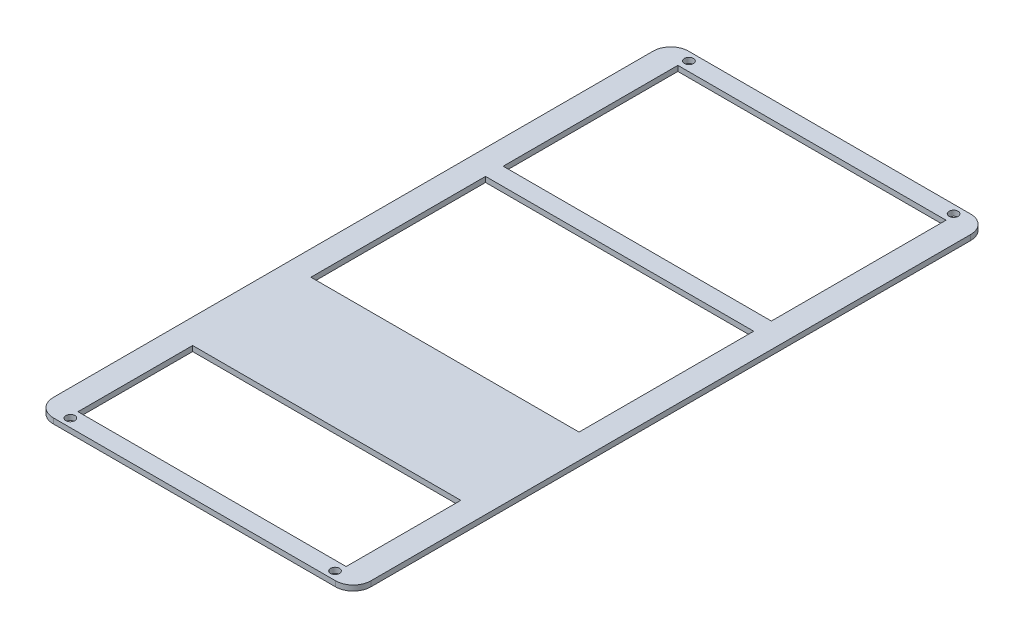
ISO-10303-21;
HEADER;
FILE_DESCRIPTION(('STEP AP214'),'2;1');
FILE_NAME('part.step','',(''),(''),'','','');
FILE_SCHEMA(('AUTOMOTIVE_DESIGN { 1 0 10303 214 1 1 1 1 }'));
ENDSEC;
DATA;
#1=APPLICATION_CONTEXT('core data for automotive mechanical design processes');
#2=APPLICATION_PROTOCOL_DEFINITION('international standard','automotive_design',2000,#1);
#3=PRODUCT_CONTEXT('',#1,'mechanical');
#4=PRODUCT('Part','Part','',(#3));
#5=PRODUCT_RELATED_PRODUCT_CATEGORY('part','',(#4));
#6=PRODUCT_DEFINITION_FORMATION('','',#4);
#7=PRODUCT_DEFINITION_CONTEXT('part definition',#1,'design');
#8=PRODUCT_DEFINITION('design','',#6,#7);
#9=PRODUCT_DEFINITION_SHAPE('','',#8);
#10=(LENGTH_UNIT() NAMED_UNIT(*) SI_UNIT(.MILLI.,.METRE.));
#11=(NAMED_UNIT(*) PLANE_ANGLE_UNIT() SI_UNIT($,.RADIAN.));
#12=(NAMED_UNIT(*) SI_UNIT($,.STERADIAN.) SOLID_ANGLE_UNIT());
#13=UNCERTAINTY_MEASURE_WITH_UNIT(LENGTH_MEASURE(1.E-05),#10,'distance_accuracy_value','');
#14=(GEOMETRIC_REPRESENTATION_CONTEXT(3) GLOBAL_UNCERTAINTY_ASSIGNED_CONTEXT((#13)) GLOBAL_UNIT_ASSIGNED_CONTEXT((#10,
#11,#12)) REPRESENTATION_CONTEXT('',''));
#15=CARTESIAN_POINT('',(0.,0.,0.));
#16=DIRECTION('',(0.,0.,1.));
#17=DIRECTION('',(1.,0.,0.));
#18=AXIS2_PLACEMENT_3D('',#15,#16,#17);
#19=CARTESIAN_POINT('',(-80.,3.,170.));
#20=DIRECTION('',(0.,1.,0.));
#21=DIRECTION('',(0.,0.,1.));
#22=AXIS2_PLACEMENT_3D('',#19,#20,#21);
#23=PLANE('',#22);
#24=CARTESIAN_POINT('',(-75.,3.,175.287107212701));
#25=DIRECTION('',(0.,1.,0.));
#26=DIRECTION('',(0.,0.,-1.));
#27=AXIS2_PLACEMENT_3D('',#24,#25,#26);
#28=CIRCLE('',#27,2.54999999999999);
#29=CARTESIAN_POINT('',(-75.,3.,172.737107212701));
#30=VERTEX_POINT('',#29);
#31=EDGE_CURVE('E625',#30,#30,#28,.T.);
#32=ORIENTED_EDGE('',*,*,#31,.F.);
#33=EDGE_LOOP('',(#32));
#34=FACE_BOUND('',#33,.T.);
#35=CARTESIAN_POINT('',(-75.,3.,-175.287107212701));
#36=DIRECTION('',(0.,1.,0.));
#37=DIRECTION('',(0.,0.,1.));
#38=AXIS2_PLACEMENT_3D('',#35,#36,#37);
#39=CIRCLE('',#38,2.54999999999999);
#40=CARTESIAN_POINT('',(-75.,3.,-172.737107212701));
#41=VERTEX_POINT('',#40);
#42=EDGE_CURVE('E212',#41,#41,#39,.T.);
#43=ORIENTED_EDGE('',*,*,#42,.F.);
#44=EDGE_LOOP('',(#43));
#45=FACE_BOUND('',#44,.T.);
#46=CARTESIAN_POINT('',(-80.,3.,170.));
#47=DIRECTION('',(0.,1.,0.));
#48=DIRECTION('',(0.,0.,1.));
#49=AXIS2_PLACEMENT_3D('',#46,#47,#48);
#50=CIRCLE('',#49,10.);
#51=CARTESIAN_POINT('',(-90.,3.,170.));
#52=VERTEX_POINT('',#51);
#53=CARTESIAN_POINT('',(-79.9999999999999,3.,180.));
#54=VERTEX_POINT('',#53);
#55=EDGE_CURVE('E314',#52,#54,#50,.T.);
#56=ORIENTED_EDGE('',*,*,#55,.T.);
#57=DIRECTION('',(1.,0.,0.));
#58=VECTOR('',#57,1.);
#59=CARTESIAN_POINT('',(-79.9999999999999,3.,180.));
#60=LINE('',#59,#58);
#61=CARTESIAN_POINT('',(80.,3.,180.));
#62=VERTEX_POINT('',#61);
#63=EDGE_CURVE('E318',#54,#62,#60,.T.);
#64=ORIENTED_EDGE('',*,*,#63,.T.);
#65=CARTESIAN_POINT('',(80.,3.,170.));
#66=DIRECTION('',(0.,1.,0.));
#67=DIRECTION('',(0.,0.,1.));
#68=AXIS2_PLACEMENT_3D('',#65,#66,#67);
#69=CIRCLE('',#68,10.);
#70=CARTESIAN_POINT('',(90.,3.,170.));
#71=VERTEX_POINT('',#70);
#72=EDGE_CURVE('E322',#62,#71,#69,.T.);
#73=ORIENTED_EDGE('',*,*,#72,.T.);
#74=DIRECTION('',(0.,0.,-1.));
#75=VECTOR('',#74,1.);
#76=CARTESIAN_POINT('',(90.,3.,170.));
#77=LINE('',#76,#75);
#78=CARTESIAN_POINT('',(90.,3.,-170.));
#79=VERTEX_POINT('',#78);
#80=EDGE_CURVE('E325',#71,#79,#77,.T.);
#81=ORIENTED_EDGE('',*,*,#80,.T.);
#82=CARTESIAN_POINT('',(80.,3.,-170.));
#83=DIRECTION('',(0.,1.,0.));
#84=DIRECTION('',(0.,0.,1.));
#85=AXIS2_PLACEMENT_3D('',#82,#83,#84);
#86=CIRCLE('',#85,10.);
#87=CARTESIAN_POINT('',(80.,3.,-180.));
#88=VERTEX_POINT('',#87);
#89=EDGE_CURVE('E328',#79,#88,#86,.T.);
#90=ORIENTED_EDGE('',*,*,#89,.T.);
#91=DIRECTION('',(-1.,0.,0.));
#92=VECTOR('',#91,1.);
#93=CARTESIAN_POINT('',(-79.9999999999999,3.,-180.));
#94=LINE('',#93,#92);
#95=CARTESIAN_POINT('',(-79.9999999999999,3.,-180.));
#96=VERTEX_POINT('',#95);
#97=EDGE_CURVE('E331',#88,#96,#94,.T.);
#98=ORIENTED_EDGE('',*,*,#97,.T.);
#99=CARTESIAN_POINT('',(-80.,3.,-170.));
#100=DIRECTION('',(0.,1.,0.));
#101=DIRECTION('',(0.,0.,1.));
#102=AXIS2_PLACEMENT_3D('',#99,#100,#101);
#103=CIRCLE('',#102,10.);
#104=CARTESIAN_POINT('',(-90.,3.,-170.));
#105=VERTEX_POINT('',#104);
#106=EDGE_CURVE('E334',#96,#105,#103,.T.);
#107=ORIENTED_EDGE('',*,*,#106,.T.);
#108=DIRECTION('',(0.,0.,1.));
#109=VECTOR('',#108,1.);
#110=CARTESIAN_POINT('',(-90.,3.,170.));
#111=LINE('',#110,#109);
#112=EDGE_CURVE('E337',#105,#52,#111,.T.);
#113=ORIENTED_EDGE('',*,*,#112,.T.);
#114=EDGE_LOOP('',(#56,#64,#73,#81,#90,#98,#107,#113));
#115=FACE_BOUND('',#114,.T.);
#116=DIRECTION('',(-1.,0.,0.));
#117=VECTOR('',#116,1.);
#118=CARTESIAN_POINT('',(-76.,3.,-170.));
#119=LINE('',#118,#117);
#120=CARTESIAN_POINT('',(76.,3.,-170.));
#121=VERTEX_POINT('',#120);
#122=CARTESIAN_POINT('',(-76.,3.,-170.));
#123=VERTEX_POINT('',#122);
#124=EDGE_CURVE('E274',#121,#123,#119,.T.);
#125=ORIENTED_EDGE('',*,*,#124,.F.);
#126=DIRECTION('',(0.,0.,-1.));
#127=VECTOR('',#126,1.);
#128=CARTESIAN_POINT('',(76.,3.,-71.));
#129=LINE('',#128,#127);
#130=CARTESIAN_POINT('',(76.,3.,-71.));
#131=VERTEX_POINT('',#130);
#132=EDGE_CURVE('E271',#131,#121,#129,.T.);
#133=ORIENTED_EDGE('',*,*,#132,.F.);
#134=DIRECTION('',(1.,0.,0.));
#135=VECTOR('',#134,1.);
#136=CARTESIAN_POINT('',(-76.,3.,-71.));
#137=LINE('',#136,#135);
#138=CARTESIAN_POINT('',(-76.,3.,-71.));
#139=VERTEX_POINT('',#138);
#140=EDGE_CURVE('E282',#139,#131,#137,.T.);
#141=ORIENTED_EDGE('',*,*,#140,.F.);
#142=DIRECTION('',(0.,0.,1.));
#143=VECTOR('',#142,1.);
#144=CARTESIAN_POINT('',(-76.,3.,-71.));
#145=LINE('',#144,#143);
#146=EDGE_CURVE('E278',#123,#139,#145,.T.);
#147=ORIENTED_EDGE('',*,*,#146,.F.);
#148=EDGE_LOOP('',(#125,#133,#141,#147));
#149=FACE_BOUND('',#148,.T.);
#150=DIRECTION('',(-1.,0.,0.));
#151=VECTOR('',#150,1.);
#152=CARTESIAN_POINT('',(-76.,3.,105.));
#153=LINE('',#152,#151);
#154=CARTESIAN_POINT('',(76.,3.,105.));
#155=VERTEX_POINT('',#154);
#156=CARTESIAN_POINT('',(-76.,3.,105.));
#157=VERTEX_POINT('',#156);
#158=EDGE_CURVE('E231',#155,#157,#153,.T.);
#159=ORIENTED_EDGE('',*,*,#158,.F.);
#160=DIRECTION('',(0.,0.,-1.));
#161=VECTOR('',#160,1.);
#162=CARTESIAN_POINT('',(76.,3.,170.));
#163=LINE('',#162,#161);
#164=CARTESIAN_POINT('',(76.,3.,170.));
#165=VERTEX_POINT('',#164);
#166=EDGE_CURVE('E228',#165,#155,#163,.T.);
#167=ORIENTED_EDGE('',*,*,#166,.F.);
#168=DIRECTION('',(1.,0.,0.));
#169=VECTOR('',#168,1.);
#170=CARTESIAN_POINT('',(-76.,3.,170.));
#171=LINE('',#170,#169);
#172=CARTESIAN_POINT('',(-76.,3.,170.));
#173=VERTEX_POINT('',#172);
#174=EDGE_CURVE('E239',#173,#165,#171,.T.);
#175=ORIENTED_EDGE('',*,*,#174,.F.);
#176=DIRECTION('',(0.,0.,1.));
#177=VECTOR('',#176,1.);
#178=CARTESIAN_POINT('',(-76.,3.,170.));
#179=LINE('',#178,#177);
#180=EDGE_CURVE('E235',#157,#173,#179,.T.);
#181=ORIENTED_EDGE('',*,*,#180,.F.);
#182=EDGE_LOOP('',(#159,#167,#175,#181));
#183=FACE_BOUND('',#182,.T.);
#184=DIRECTION('',(-1.,0.,0.));
#185=VECTOR('',#184,1.);
#186=CARTESIAN_POINT('',(-76.,3.,-61.));
#187=LINE('',#186,#185);
#188=CARTESIAN_POINT('',(76.,3.,-61.));
#189=VERTEX_POINT('',#188);
#190=CARTESIAN_POINT('',(-76.,3.,-61.));
#191=VERTEX_POINT('',#190);
#192=EDGE_CURVE('E186',#189,#191,#187,.T.);
#193=ORIENTED_EDGE('',*,*,#192,.F.);
#194=DIRECTION('',(0.,0.,-1.));
#195=VECTOR('',#194,1.);
#196=CARTESIAN_POINT('',(76.,3.,38.));
#197=LINE('',#196,#195);
#198=CARTESIAN_POINT('',(76.,3.,38.));
#199=VERTEX_POINT('',#198);
#200=EDGE_CURVE('E177',#199,#189,#197,.T.);
#201=ORIENTED_EDGE('',*,*,#200,.F.);
#202=DIRECTION('',(1.,0.,0.));
#203=VECTOR('',#202,1.);
#204=CARTESIAN_POINT('',(-76.,3.,38.));
#205=LINE('',#204,#203);
#206=CARTESIAN_POINT('',(-76.,3.,38.));
#207=VERTEX_POINT('',#206);
#208=EDGE_CURVE('E204',#207,#199,#205,.T.);
#209=ORIENTED_EDGE('',*,*,#208,.F.);
#210=DIRECTION('',(0.,0.,1.));
#211=VECTOR('',#210,1.);
#212=CARTESIAN_POINT('',(-76.,3.,38.));
#213=LINE('',#212,#211);
#214=EDGE_CURVE('E200',#191,#207,#213,.T.);
#215=ORIENTED_EDGE('',*,*,#214,.F.);
#216=EDGE_LOOP('',(#193,#201,#209,#215));
#217=FACE_BOUND('',#216,.T.);
#218=CARTESIAN_POINT('',(75.,3.,-175.287107212701));
#219=DIRECTION('',(0.,1.,0.));
#220=DIRECTION('',(0.,0.,1.));
#221=AXIS2_PLACEMENT_3D('',#218,#219,#220);
#222=CIRCLE('',#221,2.54999999999999);
#223=CARTESIAN_POINT('',(75.,3.,-172.737107212701));
#224=VERTEX_POINT('',#223);
#225=EDGE_CURVE('E633',#224,#224,#222,.T.);
#226=ORIENTED_EDGE('',*,*,#225,.F.);
#227=EDGE_LOOP('',(#226));
#228=FACE_BOUND('',#227,.T.);
#229=CARTESIAN_POINT('',(75.,3.,175.287107212701));
#230=DIRECTION('',(0.,1.,0.));
#231=DIRECTION('',(0.,0.,-1.));
#232=AXIS2_PLACEMENT_3D('',#229,#230,#231);
#233=CIRCLE('',#232,2.54999999999999);
#234=CARTESIAN_POINT('',(75.,3.,172.737107212701));
#235=VERTEX_POINT('',#234);
#236=EDGE_CURVE('E614',#235,#235,#233,.T.);
#237=ORIENTED_EDGE('',*,*,#236,.F.);
#238=EDGE_LOOP('',(#237));
#239=FACE_BOUND('',#238,.T.);
#240=ADVANCED_FACE('F39',(#34,#45,#115,#149,#183,#217,#228,#239),#23,.T.);
#241=CARTESIAN_POINT('',(-80.,0.,170.));
#242=DIRECTION('',(0.,1.,0.));
#243=DIRECTION('',(0.,0.,1.));
#244=AXIS2_PLACEMENT_3D('',#241,#242,#243);
#245=PLANE('',#244);
#246=DIRECTION('',(0.,0.,-1.));
#247=VECTOR('',#246,1.);
#248=CARTESIAN_POINT('',(76.,0.,170.));
#249=LINE('',#248,#247);
#250=CARTESIAN_POINT('',(76.,0.,170.));
#251=VERTEX_POINT('',#250);
#252=CARTESIAN_POINT('',(76.,0.,105.));
#253=VERTEX_POINT('',#252);
#254=EDGE_CURVE('E195',#251,#253,#249,.T.);
#255=ORIENTED_EDGE('',*,*,#254,.T.);
#256=DIRECTION('',(-1.,0.,0.));
#257=VECTOR('',#256,1.);
#258=CARTESIAN_POINT('',(-76.,0.,105.));
#259=LINE('',#258,#257);
#260=CARTESIAN_POINT('',(-76.,0.,105.));
#261=VERTEX_POINT('',#260);
#262=EDGE_CURVE('E246',#253,#261,#259,.T.);
#263=ORIENTED_EDGE('',*,*,#262,.T.);
#264=DIRECTION('',(0.,0.,1.));
#265=VECTOR('',#264,1.);
#266=CARTESIAN_POINT('',(-76.,0.,170.));
#267=LINE('',#266,#265);
#268=CARTESIAN_POINT('',(-76.,0.,170.));
#269=VERTEX_POINT('',#268);
#270=EDGE_CURVE('E250',#261,#269,#267,.T.);
#271=ORIENTED_EDGE('',*,*,#270,.T.);
#272=DIRECTION('',(1.,0.,0.));
#273=VECTOR('',#272,1.);
#274=CARTESIAN_POINT('',(-76.,0.,170.));
#275=LINE('',#274,#273);
#276=EDGE_CURVE('E232',#269,#251,#275,.T.);
#277=ORIENTED_EDGE('',*,*,#276,.T.);
#278=EDGE_LOOP('',(#255,#263,#271,#277));
#279=FACE_BOUND('',#278,.T.);
#280=CARTESIAN_POINT('',(-80.,0.,170.));
#281=DIRECTION('',(0.,1.,0.));
#282=DIRECTION('',(0.,0.,1.));
#283=AXIS2_PLACEMENT_3D('',#280,#281,#282);
#284=CIRCLE('',#283,10.);
#285=CARTESIAN_POINT('',(-90.,0.,170.));
#286=VERTEX_POINT('',#285);
#287=CARTESIAN_POINT('',(-79.9999999999999,0.,180.));
#288=VERTEX_POINT('',#287);
#289=EDGE_CURVE('E313',#286,#288,#284,.T.);
#290=ORIENTED_EDGE('',*,*,#289,.F.);
#291=DIRECTION('',(0.,0.,1.));
#292=VECTOR('',#291,1.);
#293=CARTESIAN_POINT('',(-90.,0.,170.));
#294=LINE('',#293,#292);
#295=CARTESIAN_POINT('',(-90.,0.,-170.));
#296=VERTEX_POINT('',#295);
#297=EDGE_CURVE('E319',#296,#286,#294,.T.);
#298=ORIENTED_EDGE('',*,*,#297,.F.);
#299=CARTESIAN_POINT('',(-80.,0.,-170.));
#300=DIRECTION('',(0.,1.,0.));
#301=DIRECTION('',(0.,0.,1.));
#302=AXIS2_PLACEMENT_3D('',#299,#300,#301);
#303=CIRCLE('',#302,10.);
#304=CARTESIAN_POINT('',(-79.9999999999999,0.,-180.));
#305=VERTEX_POINT('',#304);
#306=EDGE_CURVE('E359',#305,#296,#303,.T.);
#307=ORIENTED_EDGE('',*,*,#306,.F.);
#308=DIRECTION('',(-1.,0.,0.));
#309=VECTOR('',#308,1.);
#310=CARTESIAN_POINT('',(-79.9999999999999,0.,-180.));
#311=LINE('',#310,#309);
#312=CARTESIAN_POINT('',(80.,0.,-180.));
#313=VERTEX_POINT('',#312);
#314=EDGE_CURVE('E356',#313,#305,#311,.T.);
#315=ORIENTED_EDGE('',*,*,#314,.F.);
#316=CARTESIAN_POINT('',(80.,0.,-170.));
#317=DIRECTION('',(0.,1.,0.));
#318=DIRECTION('',(0.,0.,1.));
#319=AXIS2_PLACEMENT_3D('',#316,#317,#318);
#320=CIRCLE('',#319,10.);
#321=CARTESIAN_POINT('',(90.,0.,-170.));
#322=VERTEX_POINT('',#321);
#323=EDGE_CURVE('E353',#322,#313,#320,.T.);
#324=ORIENTED_EDGE('',*,*,#323,.F.);
#325=DIRECTION('',(0.,0.,-1.));
#326=VECTOR('',#325,1.);
#327=CARTESIAN_POINT('',(90.,0.,170.));
#328=LINE('',#327,#326);
#329=CARTESIAN_POINT('',(90.,0.,170.));
#330=VERTEX_POINT('',#329);
#331=EDGE_CURVE('E350',#330,#322,#328,.T.);
#332=ORIENTED_EDGE('',*,*,#331,.F.);
#333=CARTESIAN_POINT('',(80.,0.,170.));
#334=DIRECTION('',(0.,1.,0.));
#335=DIRECTION('',(0.,0.,1.));
#336=AXIS2_PLACEMENT_3D('',#333,#334,#335);
#337=CIRCLE('',#336,10.);
#338=CARTESIAN_POINT('',(80.,0.,180.));
#339=VERTEX_POINT('',#338);
#340=EDGE_CURVE('E347',#339,#330,#337,.T.);
#341=ORIENTED_EDGE('',*,*,#340,.F.);
#342=DIRECTION('',(1.,0.,0.));
#343=VECTOR('',#342,1.);
#344=CARTESIAN_POINT('',(-79.9999999999999,0.,180.));
#345=LINE('',#344,#343);
#346=EDGE_CURVE('E344',#288,#339,#345,.T.);
#347=ORIENTED_EDGE('',*,*,#346,.F.);
#348=EDGE_LOOP('',(#290,#298,#307,#315,#324,#332,#341,#347));
#349=FACE_BOUND('',#348,.T.);
#350=DIRECTION('',(0.,0.,-1.));
#351=VECTOR('',#350,1.);
#352=CARTESIAN_POINT('',(76.,0.,-71.));
#353=LINE('',#352,#351);
#354=CARTESIAN_POINT('',(76.,0.,-71.));
#355=VERTEX_POINT('',#354);
#356=CARTESIAN_POINT('',(76.,0.,-170.));
#357=VERTEX_POINT('',#356);
#358=EDGE_CURVE('E270',#355,#357,#353,.T.);
#359=ORIENTED_EDGE('',*,*,#358,.T.);
#360=DIRECTION('',(-1.,0.,0.));
#361=VECTOR('',#360,1.);
#362=CARTESIAN_POINT('',(-76.,0.,-170.));
#363=LINE('',#362,#361);
#364=CARTESIAN_POINT('',(-76.,0.,-170.));
#365=VERTEX_POINT('',#364);
#366=EDGE_CURVE('E289',#357,#365,#363,.T.);
#367=ORIENTED_EDGE('',*,*,#366,.T.);
#368=DIRECTION('',(0.,0.,1.));
#369=VECTOR('',#368,1.);
#370=CARTESIAN_POINT('',(-76.,0.,-71.));
#371=LINE('',#370,#369);
#372=CARTESIAN_POINT('',(-76.,0.,-71.));
#373=VERTEX_POINT('',#372);
#374=EDGE_CURVE('E293',#365,#373,#371,.T.);
#375=ORIENTED_EDGE('',*,*,#374,.T.);
#376=DIRECTION('',(1.,0.,0.));
#377=VECTOR('',#376,1.);
#378=CARTESIAN_POINT('',(-76.,0.,-71.));
#379=LINE('',#378,#377);
#380=EDGE_CURVE('E275',#373,#355,#379,.T.);
#381=ORIENTED_EDGE('',*,*,#380,.T.);
#382=EDGE_LOOP('',(#359,#367,#375,#381));
#383=FACE_BOUND('',#382,.T.);
#384=DIRECTION('',(0.,0.,-1.));
#385=VECTOR('',#384,1.);
#386=CARTESIAN_POINT('',(76.,0.,38.));
#387=LINE('',#386,#385);
#388=CARTESIAN_POINT('',(76.,0.,38.));
#389=VERTEX_POINT('',#388);
#390=CARTESIAN_POINT('',(76.,0.,-61.));
#391=VERTEX_POINT('',#390);
#392=EDGE_CURVE('E63',#389,#391,#387,.T.);
#393=ORIENTED_EDGE('',*,*,#392,.T.);
#394=DIRECTION('',(-1.,0.,0.));
#395=VECTOR('',#394,1.);
#396=CARTESIAN_POINT('',(-76.,0.,-61.));
#397=LINE('',#396,#395);
#398=CARTESIAN_POINT('',(-76.,0.,-61.));
#399=VERTEX_POINT('',#398);
#400=EDGE_CURVE('E193',#391,#399,#397,.T.);
#401=ORIENTED_EDGE('',*,*,#400,.T.);
#402=DIRECTION('',(0.,0.,1.));
#403=VECTOR('',#402,1.);
#404=CARTESIAN_POINT('',(-76.,0.,38.));
#405=LINE('',#404,#403);
#406=CARTESIAN_POINT('',(-76.,0.,38.));
#407=VERTEX_POINT('',#406);
#408=EDGE_CURVE('E215',#399,#407,#405,.T.);
#409=ORIENTED_EDGE('',*,*,#408,.T.);
#410=DIRECTION('',(1.,0.,0.));
#411=VECTOR('',#410,1.);
#412=CARTESIAN_POINT('',(-76.,0.,38.));
#413=LINE('',#412,#411);
#414=EDGE_CURVE('E187',#407,#389,#413,.T.);
#415=ORIENTED_EDGE('',*,*,#414,.T.);
#416=EDGE_LOOP('',(#393,#401,#409,#415));
#417=FACE_BOUND('',#416,.T.);
#418=CARTESIAN_POINT('',(-75.,0.,-175.287107212701));
#419=DIRECTION('',(0.,1.,0.));
#420=DIRECTION('',(0.,0.,1.));
#421=AXIS2_PLACEMENT_3D('',#418,#419,#420);
#422=CIRCLE('',#421,2.54999999999999);
#423=CARTESIAN_POINT('',(-75.,0.,-172.737107212701));
#424=VERTEX_POINT('',#423);
#425=EDGE_CURVE('E637',#424,#424,#422,.T.);
#426=ORIENTED_EDGE('',*,*,#425,.T.);
#427=EDGE_LOOP('',(#426));
#428=FACE_BOUND('',#427,.T.);
#429=CARTESIAN_POINT('',(75.,0.,-175.287107212701));
#430=DIRECTION('',(0.,1.,0.));
#431=DIRECTION('',(0.,0.,1.));
#432=AXIS2_PLACEMENT_3D('',#429,#430,#431);
#433=CIRCLE('',#432,2.54999999999999);
#434=CARTESIAN_POINT('',(75.,0.,-172.737107212701));
#435=VERTEX_POINT('',#434);
#436=EDGE_CURVE('E629',#435,#435,#433,.T.);
#437=ORIENTED_EDGE('',*,*,#436,.T.);
#438=EDGE_LOOP('',(#437));
#439=FACE_BOUND('',#438,.T.);
#440=CARTESIAN_POINT('',(-75.,0.,175.287107212701));
#441=DIRECTION('',(0.,1.,0.));
#442=DIRECTION('',(0.,0.,-1.));
#443=AXIS2_PLACEMENT_3D('',#440,#441,#442);
#444=CIRCLE('',#443,2.54999999999999);
#445=CARTESIAN_POINT('',(-75.,0.,172.737107212701));
#446=VERTEX_POINT('',#445);
#447=EDGE_CURVE('E622',#446,#446,#444,.T.);
#448=ORIENTED_EDGE('',*,*,#447,.T.);
#449=EDGE_LOOP('',(#448));
#450=FACE_BOUND('',#449,.T.);
#451=CARTESIAN_POINT('',(75.,0.,175.287107212701));
#452=DIRECTION('',(0.,1.,0.));
#453=DIRECTION('',(0.,0.,-1.));
#454=AXIS2_PLACEMENT_3D('',#451,#452,#453);
#455=CIRCLE('',#454,2.54999999999999);
#456=CARTESIAN_POINT('',(75.,0.,172.737107212701));
#457=VERTEX_POINT('',#456);
#458=EDGE_CURVE('E617',#457,#457,#455,.T.);
#459=ORIENTED_EDGE('',*,*,#458,.T.);
#460=EDGE_LOOP('',(#459));
#461=FACE_BOUND('',#460,.T.);
#462=ADVANCED_FACE('F398',(#279,#349,#383,#417,#428,#439,#450,#461),#245,.F.);
#463=CARTESIAN_POINT('',(-80.,3.,170.));
#464=DIRECTION('',(0.,-1.,0.));
#465=DIRECTION('',(0.,0.,-1.));
#466=AXIS2_PLACEMENT_3D('',#463,#464,#465);
#467=CYLINDRICAL_SURFACE('',#466,10.);
#468=ORIENTED_EDGE('',*,*,#289,.T.);
#469=DIRECTION('',(0.,-1.,0.));
#470=VECTOR('',#469,1.);
#471=CARTESIAN_POINT('',(-79.9999999999999,3.,180.));
#472=LINE('',#471,#470);
#473=EDGE_CURVE('E11',#54,#288,#472,.T.);
#474=ORIENTED_EDGE('',*,*,#473,.F.);
#475=ORIENTED_EDGE('',*,*,#55,.F.);
#476=DIRECTION('',(0.,-1.,0.));
#477=VECTOR('',#476,1.);
#478=CARTESIAN_POINT('',(-90.,3.,170.));
#479=LINE('',#478,#477);
#480=EDGE_CURVE('E340',#52,#286,#479,.T.);
#481=ORIENTED_EDGE('',*,*,#480,.T.);
#482=EDGE_LOOP('',(#468,#474,#475,#481));
#483=FACE_BOUND('',#482,.T.);
#484=ADVANCED_FACE('F41',(#483),#467,.T.);
#485=CARTESIAN_POINT('',(-79.9999999999999,3.,180.));
#486=DIRECTION('',(0.,0.,-1.));
#487=DIRECTION('',(-1.,0.,0.));
#488=AXIS2_PLACEMENT_3D('',#485,#486,#487);
#489=PLANE('',#488);
#490=ORIENTED_EDGE('',*,*,#346,.T.);
#491=DIRECTION('',(0.,-1.,0.));
#492=VECTOR('',#491,1.);
#493=CARTESIAN_POINT('',(80.,3.,180.));
#494=LINE('',#493,#492);
#495=EDGE_CURVE('E48',#62,#339,#494,.T.);
#496=ORIENTED_EDGE('',*,*,#495,.F.);
#497=ORIENTED_EDGE('',*,*,#63,.F.);
#498=ORIENTED_EDGE('',*,*,#473,.T.);
#499=EDGE_LOOP('',(#490,#496,#497,#498));
#500=FACE_BOUND('',#499,.T.);
#501=ADVANCED_FACE('F416',(#500),#489,.F.);
#502=CARTESIAN_POINT('',(80.,3.,170.));
#503=DIRECTION('',(0.,-1.,0.));
#504=DIRECTION('',(0.,0.,-1.));
#505=AXIS2_PLACEMENT_3D('',#502,#503,#504);
#506=CYLINDRICAL_SURFACE('',#505,10.);
#507=ORIENTED_EDGE('',*,*,#340,.T.);
#508=DIRECTION('',(0.,-1.,0.));
#509=VECTOR('',#508,1.);
#510=CARTESIAN_POINT('',(90.,3.,170.));
#511=LINE('',#510,#509);
#512=EDGE_CURVE('E383',#71,#330,#511,.T.);
#513=ORIENTED_EDGE('',*,*,#512,.F.);
#514=ORIENTED_EDGE('',*,*,#72,.F.);
#515=ORIENTED_EDGE('',*,*,#495,.T.);
#516=EDGE_LOOP('',(#507,#513,#514,#515));
#517=FACE_BOUND('',#516,.T.);
#518=ADVANCED_FACE('F392',(#517),#506,.T.);
#519=CARTESIAN_POINT('',(90.,3.,170.));
#520=DIRECTION('',(-1.,0.,0.));
#521=DIRECTION('',(0.,0.,1.));
#522=AXIS2_PLACEMENT_3D('',#519,#520,#521);
#523=PLANE('',#522);
#524=ORIENTED_EDGE('',*,*,#331,.T.);
#525=DIRECTION('',(0.,-1.,0.));
#526=VECTOR('',#525,1.);
#527=CARTESIAN_POINT('',(90.,3.,-170.));
#528=LINE('',#527,#526);
#529=EDGE_CURVE('E379',#79,#322,#528,.T.);
#530=ORIENTED_EDGE('',*,*,#529,.F.);
#531=ORIENTED_EDGE('',*,*,#80,.F.);
#532=ORIENTED_EDGE('',*,*,#512,.T.);
#533=EDGE_LOOP('',(#524,#530,#531,#532));
#534=FACE_BOUND('',#533,.T.);
#535=ADVANCED_FACE('F404',(#534),#523,.F.);
#536=CARTESIAN_POINT('',(80.,3.,-170.));
#537=DIRECTION('',(0.,-1.,0.));
#538=DIRECTION('',(0.,0.,-1.));
#539=AXIS2_PLACEMENT_3D('',#536,#537,#538);
#540=CYLINDRICAL_SURFACE('',#539,10.);
#541=ORIENTED_EDGE('',*,*,#323,.T.);
#542=DIRECTION('',(0.,-1.,0.));
#543=VECTOR('',#542,1.);
#544=CARTESIAN_POINT('',(80.,3.,-180.));
#545=LINE('',#544,#543);
#546=EDGE_CURVE('E375',#88,#313,#545,.T.);
#547=ORIENTED_EDGE('',*,*,#546,.F.);
#548=ORIENTED_EDGE('',*,*,#89,.F.);
#549=ORIENTED_EDGE('',*,*,#529,.T.);
#550=EDGE_LOOP('',(#541,#547,#548,#549));
#551=FACE_BOUND('',#550,.T.);
#552=ADVANCED_FACE('F408',(#551),#540,.T.);
#553=CARTESIAN_POINT('',(-79.9999999999999,3.,-180.));
#554=DIRECTION('',(0.,0.,1.));
#555=DIRECTION('',(1.,0.,0.));
#556=AXIS2_PLACEMENT_3D('',#553,#554,#555);
#557=PLANE('',#556);
#558=ORIENTED_EDGE('',*,*,#314,.T.);
#559=DIRECTION('',(0.,-1.,0.));
#560=VECTOR('',#559,1.);
#561=CARTESIAN_POINT('',(-79.9999999999999,3.,-180.));
#562=LINE('',#561,#560);
#563=EDGE_CURVE('E371',#96,#305,#562,.T.);
#564=ORIENTED_EDGE('',*,*,#563,.F.);
#565=ORIENTED_EDGE('',*,*,#97,.F.);
#566=ORIENTED_EDGE('',*,*,#546,.T.);
#567=EDGE_LOOP('',(#558,#564,#565,#566));
#568=FACE_BOUND('',#567,.T.);
#569=ADVANCED_FACE('F429',(#568),#557,.F.);
#570=CARTESIAN_POINT('',(-80.,3.,-170.));
#571=DIRECTION('',(0.,-1.,0.));
#572=DIRECTION('',(0.,0.,-1.));
#573=AXIS2_PLACEMENT_3D('',#570,#571,#572);
#574=CYLINDRICAL_SURFACE('',#573,10.);
#575=ORIENTED_EDGE('',*,*,#306,.T.);
#576=DIRECTION('',(0.,-1.,0.));
#577=VECTOR('',#576,1.);
#578=CARTESIAN_POINT('',(-90.,3.,-170.));
#579=LINE('',#578,#577);
#580=EDGE_CURVE('E367',#105,#296,#579,.T.);
#581=ORIENTED_EDGE('',*,*,#580,.F.);
#582=ORIENTED_EDGE('',*,*,#106,.F.);
#583=ORIENTED_EDGE('',*,*,#563,.T.);
#584=EDGE_LOOP('',(#575,#581,#582,#583));
#585=FACE_BOUND('',#584,.T.);
#586=ADVANCED_FACE('F427',(#585),#574,.T.);
#587=CARTESIAN_POINT('',(-90.,3.,170.));
#588=DIRECTION('',(1.,0.,0.));
#589=DIRECTION('',(0.,0.,-1.));
#590=AXIS2_PLACEMENT_3D('',#587,#588,#589);
#591=PLANE('',#590);
#592=ORIENTED_EDGE('',*,*,#297,.T.);
#593=ORIENTED_EDGE('',*,*,#480,.F.);
#594=ORIENTED_EDGE('',*,*,#112,.F.);
#595=ORIENTED_EDGE('',*,*,#580,.T.);
#596=EDGE_LOOP('',(#592,#593,#594,#595));
#597=FACE_BOUND('',#596,.T.);
#598=ADVANCED_FACE('F422',(#597),#591,.F.);
#599=CARTESIAN_POINT('',(76.,3.,-71.));
#600=DIRECTION('',(-1.,0.,0.));
#601=DIRECTION('',(0.,0.,1.));
#602=AXIS2_PLACEMENT_3D('',#599,#600,#601);
#603=PLANE('',#602);
#604=ORIENTED_EDGE('',*,*,#358,.F.);
#605=DIRECTION('',(0.,-1.,0.));
#606=VECTOR('',#605,1.);
#607=CARTESIAN_POINT('',(76.,3.,-71.));
#608=LINE('',#607,#606);
#609=EDGE_CURVE('E285',#131,#355,#608,.T.);
#610=ORIENTED_EDGE('',*,*,#609,.F.);
#611=ORIENTED_EDGE('',*,*,#132,.T.);
#612=DIRECTION('',(0.,-1.,0.));
#613=VECTOR('',#612,1.);
#614=CARTESIAN_POINT('',(76.,3.,-170.));
#615=LINE('',#614,#613);
#616=EDGE_CURVE('E309',#121,#357,#615,.T.);
#617=ORIENTED_EDGE('',*,*,#616,.T.);
#618=EDGE_LOOP('',(#604,#610,#611,#617));
#619=FACE_BOUND('',#618,.T.);
#620=ADVANCED_FACE('F449',(#619),#603,.T.);
#621=CARTESIAN_POINT('',(-76.,3.,-170.));
#622=DIRECTION('',(0.,0.,1.));
#623=DIRECTION('',(1.,0.,0.));
#624=AXIS2_PLACEMENT_3D('',#621,#622,#623);
#625=PLANE('',#624);
#626=ORIENTED_EDGE('',*,*,#366,.F.);
#627=ORIENTED_EDGE('',*,*,#616,.F.);
#628=ORIENTED_EDGE('',*,*,#124,.T.);
#629=DIRECTION('',(0.,-1.,0.));
#630=VECTOR('',#629,1.);
#631=CARTESIAN_POINT('',(-76.,3.,-170.));
#632=LINE('',#631,#630);
#633=EDGE_CURVE('E306',#123,#365,#632,.T.);
#634=ORIENTED_EDGE('',*,*,#633,.T.);
#635=EDGE_LOOP('',(#626,#627,#628,#634));
#636=FACE_BOUND('',#635,.T.);
#637=ADVANCED_FACE('F456',(#636),#625,.T.);
#638=CARTESIAN_POINT('',(-76.,3.,-71.));
#639=DIRECTION('',(1.,0.,0.));
#640=DIRECTION('',(0.,0.,-1.));
#641=AXIS2_PLACEMENT_3D('',#638,#639,#640);
#642=PLANE('',#641);
#643=ORIENTED_EDGE('',*,*,#374,.F.);
#644=ORIENTED_EDGE('',*,*,#633,.F.);
#645=ORIENTED_EDGE('',*,*,#146,.T.);
#646=DIRECTION('',(0.,-1.,0.));
#647=VECTOR('',#646,1.);
#648=CARTESIAN_POINT('',(-76.,3.,-71.));
#649=LINE('',#648,#647);
#650=EDGE_CURVE('E303',#139,#373,#649,.T.);
#651=ORIENTED_EDGE('',*,*,#650,.T.);
#652=EDGE_LOOP('',(#643,#644,#645,#651));
#653=FACE_BOUND('',#652,.T.);
#654=ADVANCED_FACE('F461',(#653),#642,.T.);
#655=CARTESIAN_POINT('',(-76.,3.,-71.));
#656=DIRECTION('',(0.,0.,-1.));
#657=DIRECTION('',(-1.,0.,0.));
#658=AXIS2_PLACEMENT_3D('',#655,#656,#657);
#659=PLANE('',#658);
#660=ORIENTED_EDGE('',*,*,#380,.F.);
#661=ORIENTED_EDGE('',*,*,#650,.F.);
#662=ORIENTED_EDGE('',*,*,#140,.T.);
#663=ORIENTED_EDGE('',*,*,#609,.T.);
#664=EDGE_LOOP('',(#660,#661,#662,#663));
#665=FACE_BOUND('',#664,.T.);
#666=ADVANCED_FACE('F468',(#665),#659,.T.);
#667=CARTESIAN_POINT('',(76.,3.,170.));
#668=DIRECTION('',(-1.,0.,0.));
#669=DIRECTION('',(0.,0.,1.));
#670=AXIS2_PLACEMENT_3D('',#667,#668,#669);
#671=PLANE('',#670);
#672=ORIENTED_EDGE('',*,*,#254,.F.);
#673=DIRECTION('',(0.,-1.,0.));
#674=VECTOR('',#673,1.);
#675=CARTESIAN_POINT('',(76.,3.,170.));
#676=LINE('',#675,#674);
#677=EDGE_CURVE('E242',#165,#251,#676,.T.);
#678=ORIENTED_EDGE('',*,*,#677,.F.);
#679=ORIENTED_EDGE('',*,*,#166,.T.);
#680=DIRECTION('',(0.,-1.,0.));
#681=VECTOR('',#680,1.);
#682=CARTESIAN_POINT('',(76.,3.,105.));
#683=LINE('',#682,#681);
#684=EDGE_CURVE('E266',#155,#253,#683,.T.);
#685=ORIENTED_EDGE('',*,*,#684,.T.);
#686=EDGE_LOOP('',(#672,#678,#679,#685));
#687=FACE_BOUND('',#686,.T.);
#688=ADVANCED_FACE('F490',(#687),#671,.T.);
#689=CARTESIAN_POINT('',(-76.,3.,105.));
#690=DIRECTION('',(0.,0.,1.));
#691=DIRECTION('',(1.,0.,0.));
#692=AXIS2_PLACEMENT_3D('',#689,#690,#691);
#693=PLANE('',#692);
#694=ORIENTED_EDGE('',*,*,#262,.F.);
#695=ORIENTED_EDGE('',*,*,#684,.F.);
#696=ORIENTED_EDGE('',*,*,#158,.T.);
#697=DIRECTION('',(0.,-1.,0.));
#698=VECTOR('',#697,1.);
#699=CARTESIAN_POINT('',(-76.,3.,105.));
#700=LINE('',#699,#698);
#701=EDGE_CURVE('E263',#157,#261,#700,.T.);
#702=ORIENTED_EDGE('',*,*,#701,.T.);
#703=EDGE_LOOP('',(#694,#695,#696,#702));
#704=FACE_BOUND('',#703,.T.);
#705=ADVANCED_FACE('F484',(#704),#693,.T.);
#706=CARTESIAN_POINT('',(-76.,3.,170.));
#707=DIRECTION('',(1.,0.,0.));
#708=DIRECTION('',(0.,0.,-1.));
#709=AXIS2_PLACEMENT_3D('',#706,#707,#708);
#710=PLANE('',#709);
#711=ORIENTED_EDGE('',*,*,#270,.F.);
#712=ORIENTED_EDGE('',*,*,#701,.F.);
#713=ORIENTED_EDGE('',*,*,#180,.T.);
#714=DIRECTION('',(0.,-1.,0.));
#715=VECTOR('',#714,1.);
#716=CARTESIAN_POINT('',(-76.,3.,170.));
#717=LINE('',#716,#715);
#718=EDGE_CURVE('E260',#173,#269,#717,.T.);
#719=ORIENTED_EDGE('',*,*,#718,.T.);
#720=EDGE_LOOP('',(#711,#712,#713,#719));
#721=FACE_BOUND('',#720,.T.);
#722=ADVANCED_FACE('F487',(#721),#710,.T.);
#723=CARTESIAN_POINT('',(-76.,3.,170.));
#724=DIRECTION('',(0.,0.,-1.));
#725=DIRECTION('',(-1.,0.,0.));
#726=AXIS2_PLACEMENT_3D('',#723,#724,#725);
#727=PLANE('',#726);
#728=ORIENTED_EDGE('',*,*,#276,.F.);
#729=ORIENTED_EDGE('',*,*,#718,.F.);
#730=ORIENTED_EDGE('',*,*,#174,.T.);
#731=ORIENTED_EDGE('',*,*,#677,.T.);
#732=EDGE_LOOP('',(#728,#729,#730,#731));
#733=FACE_BOUND('',#732,.T.);
#734=ADVANCED_FACE('F493',(#733),#727,.T.);
#735=CARTESIAN_POINT('',(76.,3.,38.));
#736=DIRECTION('',(-1.,0.,0.));
#737=DIRECTION('',(0.,0.,1.));
#738=AXIS2_PLACEMENT_3D('',#735,#736,#737);
#739=PLANE('',#738);
#740=ORIENTED_EDGE('',*,*,#392,.F.);
#741=DIRECTION('',(0.,-1.,0.));
#742=VECTOR('',#741,1.);
#743=CARTESIAN_POINT('',(76.,3.,38.));
#744=LINE('',#743,#742);
#745=EDGE_CURVE('E181',#199,#389,#744,.T.);
#746=ORIENTED_EDGE('',*,*,#745,.F.);
#747=ORIENTED_EDGE('',*,*,#200,.T.);
#748=DIRECTION('',(0.,-1.,0.));
#749=VECTOR('',#748,1.);
#750=CARTESIAN_POINT('',(76.,3.,-61.));
#751=LINE('',#750,#749);
#752=EDGE_CURVE('E180',#189,#391,#751,.T.);
#753=ORIENTED_EDGE('',*,*,#752,.T.);
#754=EDGE_LOOP('',(#740,#746,#747,#753));
#755=FACE_BOUND('',#754,.T.);
#756=ADVANCED_FACE('F179',(#755),#739,.T.);
#757=CARTESIAN_POINT('',(-76.,3.,-61.));
#758=DIRECTION('',(0.,0.,1.));
#759=DIRECTION('',(1.,0.,0.));
#760=AXIS2_PLACEMENT_3D('',#757,#758,#759);
#761=PLANE('',#760);
#762=ORIENTED_EDGE('',*,*,#400,.F.);
#763=ORIENTED_EDGE('',*,*,#752,.F.);
#764=ORIENTED_EDGE('',*,*,#192,.T.);
#765=DIRECTION('',(0.,-1.,0.));
#766=VECTOR('',#765,1.);
#767=CARTESIAN_POINT('',(-76.,3.,-61.));
#768=LINE('',#767,#766);
#769=EDGE_CURVE('E196',#191,#399,#768,.T.);
#770=ORIENTED_EDGE('',*,*,#769,.T.);
#771=EDGE_LOOP('',(#762,#763,#764,#770));
#772=FACE_BOUND('',#771,.T.);
#773=ADVANCED_FACE('F190',(#772),#761,.T.);
#774=CARTESIAN_POINT('',(-76.,3.,38.));
#775=DIRECTION('',(1.,0.,0.));
#776=DIRECTION('',(0.,0.,-1.));
#777=AXIS2_PLACEMENT_3D('',#774,#775,#776);
#778=PLANE('',#777);
#779=ORIENTED_EDGE('',*,*,#408,.F.);
#780=ORIENTED_EDGE('',*,*,#769,.F.);
#781=ORIENTED_EDGE('',*,*,#214,.T.);
#782=DIRECTION('',(0.,-1.,0.));
#783=VECTOR('',#782,1.);
#784=CARTESIAN_POINT('',(-76.,3.,38.));
#785=LINE('',#784,#783);
#786=EDGE_CURVE('E55',#207,#407,#785,.T.);
#787=ORIENTED_EDGE('',*,*,#786,.T.);
#788=EDGE_LOOP('',(#779,#780,#781,#787));
#789=FACE_BOUND('',#788,.T.);
#790=ADVANCED_FACE('F550',(#789),#778,.T.);
#791=CARTESIAN_POINT('',(-76.,3.,38.));
#792=DIRECTION('',(0.,0.,-1.));
#793=DIRECTION('',(-1.,0.,0.));
#794=AXIS2_PLACEMENT_3D('',#791,#792,#793);
#795=PLANE('',#794);
#796=ORIENTED_EDGE('',*,*,#414,.F.);
#797=ORIENTED_EDGE('',*,*,#786,.F.);
#798=ORIENTED_EDGE('',*,*,#208,.T.);
#799=ORIENTED_EDGE('',*,*,#745,.T.);
#800=EDGE_LOOP('',(#796,#797,#798,#799));
#801=FACE_BOUND('',#800,.T.);
#802=ADVANCED_FACE('F558',(#801),#795,.T.);
#803=CARTESIAN_POINT('',(-75.,3.,-175.287107212701));
#804=DIRECTION('',(0.,-1.,0.));
#805=DIRECTION('',(0.,0.,-1.));
#806=AXIS2_PLACEMENT_3D('',#803,#804,#805);
#807=CYLINDRICAL_SURFACE('',#806,2.54999999999999);
#808=ORIENTED_EDGE('',*,*,#42,.T.);
#809=EDGE_LOOP('',(#808));
#810=FACE_BOUND('',#809,.T.);
#811=ORIENTED_EDGE('',*,*,#425,.F.);
#812=EDGE_LOOP('',(#811));
#813=FACE_BOUND('',#812,.T.);
#814=ADVANCED_FACE('F568',(#810,#813),#807,.F.);
#815=CARTESIAN_POINT('',(75.,3.,-175.287107212701));
#816=DIRECTION('',(0.,-1.,0.));
#817=DIRECTION('',(0.,0.,-1.));
#818=AXIS2_PLACEMENT_3D('',#815,#816,#817);
#819=CYLINDRICAL_SURFACE('',#818,2.54999999999999);
#820=ORIENTED_EDGE('',*,*,#225,.T.);
#821=EDGE_LOOP('',(#820));
#822=FACE_BOUND('',#821,.T.);
#823=ORIENTED_EDGE('',*,*,#436,.F.);
#824=EDGE_LOOP('',(#823));
#825=FACE_BOUND('',#824,.T.);
#826=ADVANCED_FACE('F577',(#822,#825),#819,.F.);
#827=CARTESIAN_POINT('',(-75.,3.,175.287107212701));
#828=DIRECTION('',(0.,-1.,0.));
#829=DIRECTION('',(0.,0.,-1.));
#830=AXIS2_PLACEMENT_3D('',#827,#828,#829);
#831=CYLINDRICAL_SURFACE('',#830,2.54999999999999);
#832=ORIENTED_EDGE('',*,*,#31,.T.);
#833=EDGE_LOOP('',(#832));
#834=FACE_BOUND('',#833,.T.);
#835=ORIENTED_EDGE('',*,*,#447,.F.);
#836=EDGE_LOOP('',(#835));
#837=FACE_BOUND('',#836,.T.);
#838=ADVANCED_FACE('F587',(#834,#837),#831,.F.);
#839=CARTESIAN_POINT('',(75.,3.,175.287107212701));
#840=DIRECTION('',(0.,-1.,0.));
#841=DIRECTION('',(0.,0.,-1.));
#842=AXIS2_PLACEMENT_3D('',#839,#840,#841);
#843=CYLINDRICAL_SURFACE('',#842,2.54999999999999);
#844=ORIENTED_EDGE('',*,*,#236,.T.);
#845=EDGE_LOOP('',(#844));
#846=FACE_BOUND('',#845,.T.);
#847=ORIENTED_EDGE('',*,*,#458,.F.);
#848=EDGE_LOOP('',(#847));
#849=FACE_BOUND('',#848,.T.);
#850=ADVANCED_FACE('F597',(#846,#849),#843,.F.);
#851=CLOSED_SHELL('',(#240,#462,#484,#501,#518,#535,#552,#569,#586,#598,#620,#637,#654,#666,
#688,#705,#722,#734,#756,#773,#790,#802,#814,#826,#838,#850));
#852=MANIFOLD_SOLID_BREP('B2',#851);
#853=ADVANCED_BREP_SHAPE_REPRESENTATION('',(#18,#852),#14);
#854=SHAPE_DEFINITION_REPRESENTATION(#9,#853);
ENDSEC;
END-ISO-10303-21;
